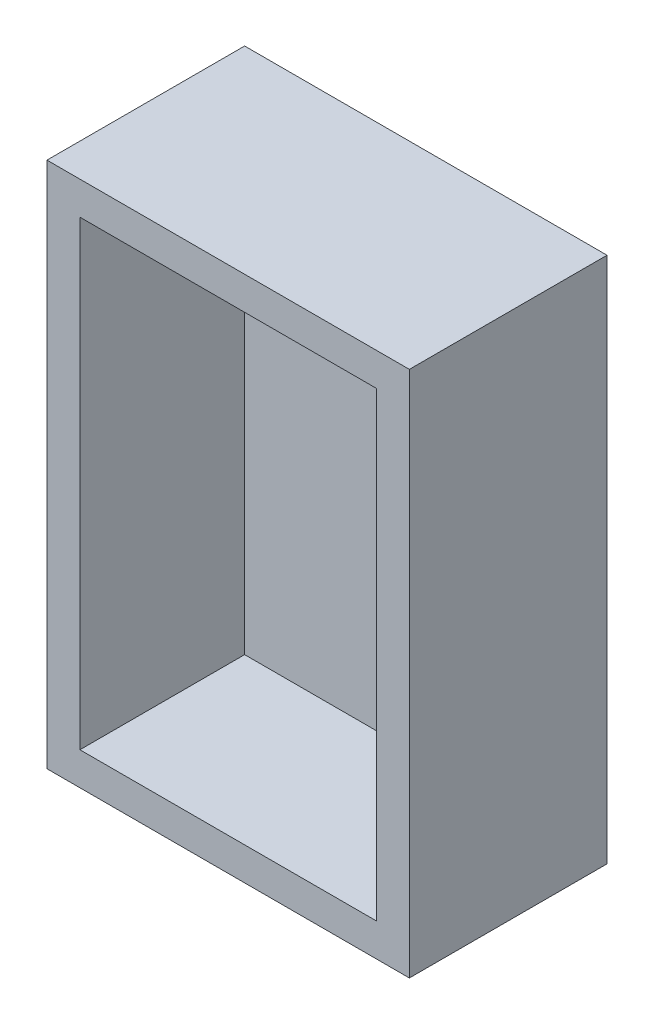
ISO-10303-21;
HEADER;
FILE_DESCRIPTION(('STEP AP214'),'2;1');
FILE_NAME('part.step','',(''),(''),'','','');
FILE_SCHEMA(('AUTOMOTIVE_DESIGN { 1 0 10303 214 1 1 1 1 }'));
ENDSEC;
DATA;
#1=APPLICATION_CONTEXT('core data for automotive mechanical design processes');
#2=APPLICATION_PROTOCOL_DEFINITION('international standard','automotive_design',2000,#1);
#3=PRODUCT_CONTEXT('',#1,'mechanical');
#4=PRODUCT('Part','Part','',(#3));
#5=PRODUCT_RELATED_PRODUCT_CATEGORY('part','',(#4));
#6=PRODUCT_DEFINITION_FORMATION('','',#4);
#7=PRODUCT_DEFINITION_CONTEXT('part definition',#1,'design');
#8=PRODUCT_DEFINITION('design','',#6,#7);
#9=PRODUCT_DEFINITION_SHAPE('','',#8);
#10=(LENGTH_UNIT() NAMED_UNIT(*) SI_UNIT(.MILLI.,.METRE.));
#11=(NAMED_UNIT(*) PLANE_ANGLE_UNIT() SI_UNIT($,.RADIAN.));
#12=(NAMED_UNIT(*) SI_UNIT($,.STERADIAN.) SOLID_ANGLE_UNIT());
#13=UNCERTAINTY_MEASURE_WITH_UNIT(LENGTH_MEASURE(1.E-05),#10,'distance_accuracy_value','');
#14=(GEOMETRIC_REPRESENTATION_CONTEXT(3) GLOBAL_UNCERTAINTY_ASSIGNED_CONTEXT((#13)) GLOBAL_UNIT_ASSIGNED_CONTEXT((#10,
#11,#12)) REPRESENTATION_CONTEXT('',''));
#15=CARTESIAN_POINT('',(0.,0.,0.));
#16=DIRECTION('',(0.,0.,1.));
#17=DIRECTION('',(1.,0.,0.));
#18=AXIS2_PLACEMENT_3D('',#15,#16,#17);
#19=CARTESIAN_POINT('',(0.,0.,6.));
#20=DIRECTION('',(0.,0.,-1.));
#21=DIRECTION('',(-1.,0.,0.));
#22=AXIS2_PLACEMENT_3D('',#19,#20,#21);
#23=PLANE('',#22);
#24=DIRECTION('',(0.,-1.,0.));
#25=VECTOR('',#24,1.);
#26=CARTESIAN_POINT('',(-11.,0.,6.));
#27=LINE('',#26,#25);
#28=CARTESIAN_POINT('',(-11.,32.,6.));
#29=VERTEX_POINT('',#28);
#30=CARTESIAN_POINT('',(-11.,0.,6.));
#31=VERTEX_POINT('',#30);
#32=EDGE_CURVE('E149',#29,#31,#27,.T.);
#33=ORIENTED_EDGE('',*,*,#32,.T.);
#34=DIRECTION('',(1.,0.,0.));
#35=VECTOR('',#34,1.);
#36=CARTESIAN_POINT('',(-11.,0.,6.));
#37=LINE('',#36,#35);
#38=CARTESIAN_POINT('',(11.,0.,6.));
#39=VERTEX_POINT('',#38);
#40=EDGE_CURVE('E96',#31,#39,#37,.T.);
#41=ORIENTED_EDGE('',*,*,#40,.T.);
#42=DIRECTION('',(0.,1.,0.));
#43=VECTOR('',#42,1.);
#44=CARTESIAN_POINT('',(11.,0.,6.));
#45=LINE('',#44,#43);
#46=CARTESIAN_POINT('',(11.,32.,6.));
#47=VERTEX_POINT('',#46);
#48=EDGE_CURVE('E152',#39,#47,#45,.T.);
#49=ORIENTED_EDGE('',*,*,#48,.T.);
#50=DIRECTION('',(-1.,0.,0.));
#51=VECTOR('',#50,1.);
#52=CARTESIAN_POINT('',(-11.,32.,6.));
#53=LINE('',#52,#51);
#54=EDGE_CURVE('E67',#47,#29,#53,.T.);
#55=ORIENTED_EDGE('',*,*,#54,.T.);
#56=EDGE_LOOP('',(#33,#41,#49,#55));
#57=FACE_BOUND('',#56,.T.);
#58=DIRECTION('',(0.,-1.,0.));
#59=VECTOR('',#58,1.);
#60=CARTESIAN_POINT('',(-9.,0.,6.));
#61=LINE('',#60,#59);
#62=CARTESIAN_POINT('',(-9.,30.,6.));
#63=VERTEX_POINT('',#62);
#64=CARTESIAN_POINT('',(-9.,2.,6.));
#65=VERTEX_POINT('',#64);
#66=EDGE_CURVE('E11',#63,#65,#61,.T.);
#67=ORIENTED_EDGE('',*,*,#66,.F.);
#68=DIRECTION('',(-1.,0.,0.));
#69=VECTOR('',#68,1.);
#70=CARTESIAN_POINT('',(0.,30.,6.));
#71=LINE('',#70,#69);
#72=CARTESIAN_POINT('',(9.,30.,6.));
#73=VERTEX_POINT('',#72);
#74=EDGE_CURVE('E171',#73,#63,#71,.T.);
#75=ORIENTED_EDGE('',*,*,#74,.F.);
#76=DIRECTION('',(0.,1.,0.));
#77=VECTOR('',#76,1.);
#78=CARTESIAN_POINT('',(9.,0.,6.));
#79=LINE('',#78,#77);
#80=CARTESIAN_POINT('',(9.,2.,6.));
#81=VERTEX_POINT('',#80);
#82=EDGE_CURVE('E173',#81,#73,#79,.T.);
#83=ORIENTED_EDGE('',*,*,#82,.F.);
#84=DIRECTION('',(1.,0.,0.));
#85=VECTOR('',#84,1.);
#86=CARTESIAN_POINT('',(0.,2.,6.));
#87=LINE('',#86,#85);
#88=EDGE_CURVE('E51',#65,#81,#87,.T.);
#89=ORIENTED_EDGE('',*,*,#88,.F.);
#90=EDGE_LOOP('',(#67,#75,#83,#89));
#91=FACE_BOUND('',#90,.T.);
#92=ADVANCED_FACE('F43',(#57,#91),#23,.F.);
#93=CARTESIAN_POINT('',(-11.,0.,6.));
#94=DIRECTION('',(1.,0.,0.));
#95=DIRECTION('',(0.,0.,-1.));
#96=AXIS2_PLACEMENT_3D('',#93,#94,#95);
#97=PLANE('',#96);
#98=DIRECTION('',(0.,-1.,0.));
#99=VECTOR('',#98,1.);
#100=CARTESIAN_POINT('',(-11.,0.,-6.));
#101=LINE('',#100,#99);
#102=CARTESIAN_POINT('',(-11.,32.,-6.));
#103=VERTEX_POINT('',#102);
#104=CARTESIAN_POINT('',(-11.,0.,-6.));
#105=VERTEX_POINT('',#104);
#106=EDGE_CURVE('E126',#103,#105,#101,.T.);
#107=ORIENTED_EDGE('',*,*,#106,.T.);
#108=DIRECTION('',(0.,0.,-1.));
#109=VECTOR('',#108,1.);
#110=CARTESIAN_POINT('',(-11.,0.,6.));
#111=LINE('',#110,#109);
#112=EDGE_CURVE('E169',#31,#105,#111,.T.);
#113=ORIENTED_EDGE('',*,*,#112,.F.);
#114=ORIENTED_EDGE('',*,*,#32,.F.);
#115=DIRECTION('',(0.,0.,-1.));
#116=VECTOR('',#115,1.);
#117=CARTESIAN_POINT('',(-11.,32.,6.));
#118=LINE('',#117,#116);
#119=EDGE_CURVE('E155',#29,#103,#118,.T.);
#120=ORIENTED_EDGE('',*,*,#119,.T.);
#121=EDGE_LOOP('',(#107,#113,#114,#120));
#122=FACE_BOUND('',#121,.T.);
#123=ADVANCED_FACE('F45',(#122),#97,.F.);
#124=CARTESIAN_POINT('',(-11.,0.,6.));
#125=DIRECTION('',(0.,1.,0.));
#126=DIRECTION('',(0.,0.,1.));
#127=AXIS2_PLACEMENT_3D('',#124,#125,#126);
#128=PLANE('',#127);
#129=DIRECTION('',(1.,0.,0.));
#130=VECTOR('',#129,1.);
#131=CARTESIAN_POINT('',(-11.,0.,-6.));
#132=LINE('',#131,#130);
#133=CARTESIAN_POINT('',(11.,0.,-6.));
#134=VERTEX_POINT('',#133);
#135=EDGE_CURVE('E158',#105,#134,#132,.T.);
#136=ORIENTED_EDGE('',*,*,#135,.T.);
#137=DIRECTION('',(0.,0.,-1.));
#138=VECTOR('',#137,1.);
#139=CARTESIAN_POINT('',(11.,0.,6.));
#140=LINE('',#139,#138);
#141=EDGE_CURVE('E166',#39,#134,#140,.T.);
#142=ORIENTED_EDGE('',*,*,#141,.F.);
#143=ORIENTED_EDGE('',*,*,#40,.F.);
#144=ORIENTED_EDGE('',*,*,#112,.T.);
#145=EDGE_LOOP('',(#136,#142,#143,#144));
#146=FACE_BOUND('',#145,.T.);
#147=ADVANCED_FACE('F192',(#146),#128,.F.);
#148=CARTESIAN_POINT('',(11.,0.,6.));
#149=DIRECTION('',(-1.,0.,0.));
#150=DIRECTION('',(0.,0.,1.));
#151=AXIS2_PLACEMENT_3D('',#148,#149,#150);
#152=PLANE('',#151);
#153=DIRECTION('',(0.,1.,0.));
#154=VECTOR('',#153,1.);
#155=CARTESIAN_POINT('',(11.,0.,-6.));
#156=LINE('',#155,#154);
#157=CARTESIAN_POINT('',(11.,32.,-6.));
#158=VERTEX_POINT('',#157);
#159=EDGE_CURVE('E160',#134,#158,#156,.T.);
#160=ORIENTED_EDGE('',*,*,#159,.T.);
#161=DIRECTION('',(0.,0.,-1.));
#162=VECTOR('',#161,1.);
#163=CARTESIAN_POINT('',(11.,32.,6.));
#164=LINE('',#163,#162);
#165=EDGE_CURVE('E164',#47,#158,#164,.T.);
#166=ORIENTED_EDGE('',*,*,#165,.F.);
#167=ORIENTED_EDGE('',*,*,#48,.F.);
#168=ORIENTED_EDGE('',*,*,#141,.T.);
#169=EDGE_LOOP('',(#160,#166,#167,#168));
#170=FACE_BOUND('',#169,.T.);
#171=ADVANCED_FACE('F204',(#170),#152,.F.);
#172=CARTESIAN_POINT('',(-11.,32.,6.));
#173=DIRECTION('',(0.,-1.,0.));
#174=DIRECTION('',(0.,0.,-1.));
#175=AXIS2_PLACEMENT_3D('',#172,#173,#174);
#176=PLANE('',#175);
#177=DIRECTION('',(-1.,0.,0.));
#178=VECTOR('',#177,1.);
#179=CARTESIAN_POINT('',(-11.,32.,-6.));
#180=LINE('',#179,#178);
#181=EDGE_CURVE('E88',#158,#103,#180,.T.);
#182=ORIENTED_EDGE('',*,*,#181,.T.);
#183=ORIENTED_EDGE('',*,*,#119,.F.);
#184=ORIENTED_EDGE('',*,*,#54,.F.);
#185=ORIENTED_EDGE('',*,*,#165,.T.);
#186=EDGE_LOOP('',(#182,#183,#184,#185));
#187=FACE_BOUND('',#186,.T.);
#188=ADVANCED_FACE('F200',(#187),#176,.F.);
#189=CARTESIAN_POINT('',(0.,0.,-6.));
#190=DIRECTION('',(0.,0.,-1.));
#191=DIRECTION('',(-1.,0.,0.));
#192=AXIS2_PLACEMENT_3D('',#189,#190,#191);
#193=PLANE('',#192);
#194=ORIENTED_EDGE('',*,*,#106,.F.);
#195=ORIENTED_EDGE('',*,*,#181,.F.);
#196=ORIENTED_EDGE('',*,*,#159,.F.);
#197=ORIENTED_EDGE('',*,*,#135,.F.);
#198=EDGE_LOOP('',(#194,#195,#196,#197));
#199=FACE_BOUND('',#198,.T.);
#200=ADVANCED_FACE('F197',(#199),#193,.T.);
#201=CARTESIAN_POINT('',(-9.,2.,7.));
#202=DIRECTION('',(1.,0.,0.));
#203=DIRECTION('',(0.,0.,-1.));
#204=AXIS2_PLACEMENT_3D('',#201,#202,#203);
#205=PLANE('',#204);
#206=ORIENTED_EDGE('',*,*,#66,.T.);
#207=DIRECTION('',(0.,0.,-1.));
#208=VECTOR('',#207,1.);
#209=CARTESIAN_POINT('',(-9.,2.,7.));
#210=LINE('',#209,#208);
#211=CARTESIAN_POINT('',(-9.,2.,-4.));
#212=VERTEX_POINT('',#211);
#213=EDGE_CURVE('E117',#65,#212,#210,.T.);
#214=ORIENTED_EDGE('',*,*,#213,.T.);
#215=DIRECTION('',(0.,-1.,0.));
#216=VECTOR('',#215,1.);
#217=CARTESIAN_POINT('',(-9.,2.,-4.));
#218=LINE('',#217,#216);
#219=CARTESIAN_POINT('',(-9.,30.,-4.));
#220=VERTEX_POINT('',#219);
#221=EDGE_CURVE('E122',#220,#212,#218,.T.);
#222=ORIENTED_EDGE('',*,*,#221,.F.);
#223=DIRECTION('',(0.,0.,-1.));
#224=VECTOR('',#223,1.);
#225=CARTESIAN_POINT('',(-9.,30.,7.));
#226=LINE('',#225,#224);
#227=EDGE_CURVE('E145',#63,#220,#226,.T.);
#228=ORIENTED_EDGE('',*,*,#227,.F.);
#229=EDGE_LOOP('',(#206,#214,#222,#228));
#230=FACE_BOUND('',#229,.T.);
#231=ADVANCED_FACE('F119',(#230),#205,.T.);
#232=CARTESIAN_POINT('',(-9.,2.,7.));
#233=DIRECTION('',(0.,1.,0.));
#234=DIRECTION('',(0.,0.,1.));
#235=AXIS2_PLACEMENT_3D('',#232,#233,#234);
#236=PLANE('',#235);
#237=ORIENTED_EDGE('',*,*,#88,.T.);
#238=DIRECTION('',(0.,0.,-1.));
#239=VECTOR('',#238,1.);
#240=CARTESIAN_POINT('',(9.,2.,7.));
#241=LINE('',#240,#239);
#242=CARTESIAN_POINT('',(9.,2.,-4.));
#243=VERTEX_POINT('',#242);
#244=EDGE_CURVE('E127',#81,#243,#241,.T.);
#245=ORIENTED_EDGE('',*,*,#244,.T.);
#246=DIRECTION('',(1.,0.,0.));
#247=VECTOR('',#246,1.);
#248=CARTESIAN_POINT('',(-9.,2.,-4.));
#249=LINE('',#248,#247);
#250=EDGE_CURVE('E130',#212,#243,#249,.T.);
#251=ORIENTED_EDGE('',*,*,#250,.F.);
#252=ORIENTED_EDGE('',*,*,#213,.F.);
#253=EDGE_LOOP('',(#237,#245,#251,#252));
#254=FACE_BOUND('',#253,.T.);
#255=ADVANCED_FACE('F131',(#254),#236,.T.);
#256=CARTESIAN_POINT('',(9.,2.,7.));
#257=DIRECTION('',(-1.,0.,0.));
#258=DIRECTION('',(0.,0.,1.));
#259=AXIS2_PLACEMENT_3D('',#256,#257,#258);
#260=PLANE('',#259);
#261=ORIENTED_EDGE('',*,*,#82,.T.);
#262=DIRECTION('',(0.,0.,-1.));
#263=VECTOR('',#262,1.);
#264=CARTESIAN_POINT('',(9.,30.,7.));
#265=LINE('',#264,#263);
#266=CARTESIAN_POINT('',(9.,30.,-4.));
#267=VERTEX_POINT('',#266);
#268=EDGE_CURVE('E58',#73,#267,#265,.T.);
#269=ORIENTED_EDGE('',*,*,#268,.T.);
#270=DIRECTION('',(0.,1.,0.));
#271=VECTOR('',#270,1.);
#272=CARTESIAN_POINT('',(9.,2.,-4.));
#273=LINE('',#272,#271);
#274=EDGE_CURVE('E136',#243,#267,#273,.T.);
#275=ORIENTED_EDGE('',*,*,#274,.F.);
#276=ORIENTED_EDGE('',*,*,#244,.F.);
#277=EDGE_LOOP('',(#261,#269,#275,#276));
#278=FACE_BOUND('',#277,.T.);
#279=ADVANCED_FACE('F177',(#278),#260,.T.);
#280=CARTESIAN_POINT('',(-9.,30.,7.));
#281=DIRECTION('',(0.,-1.,0.));
#282=DIRECTION('',(0.,0.,-1.));
#283=AXIS2_PLACEMENT_3D('',#280,#281,#282);
#284=PLANE('',#283);
#285=ORIENTED_EDGE('',*,*,#74,.T.);
#286=ORIENTED_EDGE('',*,*,#227,.T.);
#287=DIRECTION('',(-1.,0.,0.));
#288=VECTOR('',#287,1.);
#289=CARTESIAN_POINT('',(-9.,30.,-4.));
#290=LINE('',#289,#288);
#291=EDGE_CURVE('E140',#267,#220,#290,.T.);
#292=ORIENTED_EDGE('',*,*,#291,.F.);
#293=ORIENTED_EDGE('',*,*,#268,.F.);
#294=EDGE_LOOP('',(#285,#286,#292,#293));
#295=FACE_BOUND('',#294,.T.);
#296=ADVANCED_FACE('F179',(#295),#284,.T.);
#297=CARTESIAN_POINT('',(0.,0.,-4.));
#298=DIRECTION('',(0.,0.,-1.));
#299=DIRECTION('',(-1.,0.,0.));
#300=AXIS2_PLACEMENT_3D('',#297,#298,#299);
#301=PLANE('',#300);
#302=ORIENTED_EDGE('',*,*,#221,.T.);
#303=ORIENTED_EDGE('',*,*,#250,.T.);
#304=ORIENTED_EDGE('',*,*,#274,.T.);
#305=ORIENTED_EDGE('',*,*,#291,.T.);
#306=EDGE_LOOP('',(#302,#303,#304,#305));
#307=FACE_BOUND('',#306,.T.);
#308=ADVANCED_FACE('F139',(#307),#301,.F.);
#309=CLOSED_SHELL('',(#92,#123,#147,#171,#188,#200,#231,#255,#279,#296,#308));
#310=MANIFOLD_SOLID_BREP('B2',#309);
#311=ADVANCED_BREP_SHAPE_REPRESENTATION('',(#18,#310),#14);
#312=SHAPE_DEFINITION_REPRESENTATION(#9,#311);
ENDSEC;
END-ISO-10303-21;
